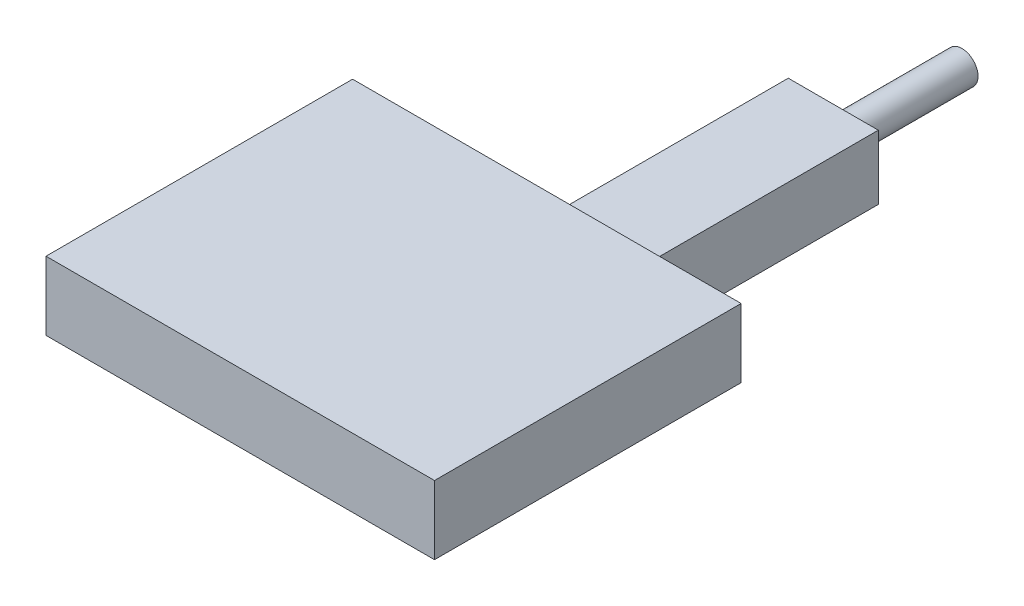
ISO-10303-21;
HEADER;
FILE_DESCRIPTION(('STEP AP214'),'2;1');
FILE_NAME('part.step','',(''),(''),'','','');
FILE_SCHEMA(('AUTOMOTIVE_DESIGN { 1 0 10303 214 1 1 1 1 }'));
ENDSEC;
DATA;
#1=APPLICATION_CONTEXT('core data for automotive mechanical design processes');
#2=APPLICATION_PROTOCOL_DEFINITION('international standard','automotive_design',2000,#1);
#3=PRODUCT_CONTEXT('',#1,'mechanical');
#4=PRODUCT('Part','Part','',(#3));
#5=PRODUCT_RELATED_PRODUCT_CATEGORY('part','',(#4));
#6=PRODUCT_DEFINITION_FORMATION('','',#4);
#7=PRODUCT_DEFINITION_CONTEXT('part definition',#1,'design');
#8=PRODUCT_DEFINITION('design','',#6,#7);
#9=PRODUCT_DEFINITION_SHAPE('','',#8);
#10=(LENGTH_UNIT() NAMED_UNIT(*) SI_UNIT(.MILLI.,.METRE.));
#11=(NAMED_UNIT(*) PLANE_ANGLE_UNIT() SI_UNIT($,.RADIAN.));
#12=(NAMED_UNIT(*) SI_UNIT($,.STERADIAN.) SOLID_ANGLE_UNIT());
#13=UNCERTAINTY_MEASURE_WITH_UNIT(LENGTH_MEASURE(1.E-05),#10,'distance_accuracy_value','');
#14=(GEOMETRIC_REPRESENTATION_CONTEXT(3) GLOBAL_UNCERTAINTY_ASSIGNED_CONTEXT((#13)) GLOBAL_UNIT_ASSIGNED_CONTEXT((#10,
#11,#12)) REPRESENTATION_CONTEXT('',''));
#15=CARTESIAN_POINT('',(0.,0.,0.));
#16=DIRECTION('',(0.,0.,1.));
#17=DIRECTION('',(1.,0.,0.));
#18=AXIS2_PLACEMENT_3D('',#15,#16,#17);
#19=CARTESIAN_POINT('',(-45.3,16.,-35.75));
#20=DIRECTION('',(0.,0.,1.));
#21=DIRECTION('',(1.,0.,0.));
#22=AXIS2_PLACEMENT_3D('',#19,#20,#21);
#23=PLANE('',#22);
#24=DIRECTION('',(0.,-1.,0.));
#25=VECTOR('',#24,1.);
#26=CARTESIAN_POINT('',(25.3,15.,-35.75));
#27=LINE('',#26,#25);
#28=CARTESIAN_POINT('',(25.3,15.,-35.75));
#29=VERTEX_POINT('',#28);
#30=CARTESIAN_POINT('',(25.3,0.,-35.75));
#31=VERTEX_POINT('',#30);
#32=EDGE_CURVE('E205',#29,#31,#27,.T.);
#33=ORIENTED_EDGE('',*,*,#32,.F.);
#34=DIRECTION('',(1.,0.,0.));
#35=VECTOR('',#34,1.);
#36=CARTESIAN_POINT('',(25.3,15.,-35.75));
#37=LINE('',#36,#35);
#38=CARTESIAN_POINT('',(4.30000000000002,15.,-35.75));
#39=VERTEX_POINT('',#38);
#40=EDGE_CURVE('E134',#39,#29,#37,.T.);
#41=ORIENTED_EDGE('',*,*,#40,.F.);
#42=DIRECTION('',(0.,-1.,0.));
#43=VECTOR('',#42,1.);
#44=CARTESIAN_POINT('',(4.30000000000002,15.,-35.75));
#45=LINE('',#44,#43);
#46=CARTESIAN_POINT('',(4.30000000000002,0.,-35.75));
#47=VERTEX_POINT('',#46);
#48=EDGE_CURVE('E150',#39,#47,#45,.T.);
#49=ORIENTED_EDGE('',*,*,#48,.T.);
#50=DIRECTION('',(-1.,0.,0.));
#51=VECTOR('',#50,1.);
#52=CARTESIAN_POINT('',(-45.3,0.,-35.75));
#53=LINE('',#52,#51);
#54=CARTESIAN_POINT('',(-45.3,0.,-35.75));
#55=VERTEX_POINT('',#54);
#56=EDGE_CURVE('E148',#47,#55,#53,.T.);
#57=ORIENTED_EDGE('',*,*,#56,.T.);
#58=DIRECTION('',(0.,-1.,0.));
#59=VECTOR('',#58,1.);
#60=CARTESIAN_POINT('',(-45.3,16.,-35.75));
#61=LINE('',#60,#59);
#62=CARTESIAN_POINT('',(-45.3,16.,-35.75));
#63=VERTEX_POINT('',#62);
#64=EDGE_CURVE('E178',#63,#55,#61,.T.);
#65=ORIENTED_EDGE('',*,*,#64,.F.);
#66=DIRECTION('',(-1.,0.,0.));
#67=VECTOR('',#66,1.);
#68=CARTESIAN_POINT('',(-45.3,16.,-35.75));
#69=LINE('',#68,#67);
#70=CARTESIAN_POINT('',(45.3,16.,-35.75));
#71=VERTEX_POINT('',#70);
#72=EDGE_CURVE('E94',#71,#63,#69,.T.);
#73=ORIENTED_EDGE('',*,*,#72,.F.);
#74=DIRECTION('',(0.,-1.,0.));
#75=VECTOR('',#74,1.);
#76=CARTESIAN_POINT('',(45.3,16.,-35.75));
#77=LINE('',#76,#75);
#78=CARTESIAN_POINT('',(45.3,0.,-35.75));
#79=VERTEX_POINT('',#78);
#80=EDGE_CURVE('E43',#71,#79,#77,.T.);
#81=ORIENTED_EDGE('',*,*,#80,.T.);
#82=EDGE_CURVE('E165',#79,#31,#53,.T.);
#83=ORIENTED_EDGE('',*,*,#82,.T.);
#84=EDGE_LOOP('',(#33,#41,#49,#57,#65,#73,#81,#83));
#85=FACE_BOUND('',#84,.T.);
#86=ADVANCED_FACE('F39',(#85),#23,.F.);
#87=CARTESIAN_POINT('',(45.3,16.,-35.75));
#88=DIRECTION('',(-1.,0.,0.));
#89=DIRECTION('',(0.,0.,1.));
#90=AXIS2_PLACEMENT_3D('',#87,#88,#89);
#91=PLANE('',#90);
#92=DIRECTION('',(0.,0.,-1.));
#93=VECTOR('',#92,1.);
#94=CARTESIAN_POINT('',(45.3,0.,-35.75));
#95=LINE('',#94,#93);
#96=CARTESIAN_POINT('',(45.3,0.,35.75));
#97=VERTEX_POINT('',#96);
#98=EDGE_CURVE('E143',#97,#79,#95,.T.);
#99=ORIENTED_EDGE('',*,*,#98,.T.);
#100=ORIENTED_EDGE('',*,*,#80,.F.);
#101=DIRECTION('',(0.,0.,-1.));
#102=VECTOR('',#101,1.);
#103=CARTESIAN_POINT('',(45.3,16.,-35.75));
#104=LINE('',#103,#102);
#105=CARTESIAN_POINT('',(45.3,16.,35.75));
#106=VERTEX_POINT('',#105);
#107=EDGE_CURVE('E154',#106,#71,#104,.T.);
#108=ORIENTED_EDGE('',*,*,#107,.F.);
#109=DIRECTION('',(0.,-1.,0.));
#110=VECTOR('',#109,1.);
#111=CARTESIAN_POINT('',(45.3,16.,35.75));
#112=LINE('',#111,#110);
#113=EDGE_CURVE('E163',#106,#97,#112,.T.);
#114=ORIENTED_EDGE('',*,*,#113,.T.);
#115=EDGE_LOOP('',(#99,#100,#108,#114));
#116=FACE_BOUND('',#115,.T.);
#117=ADVANCED_FACE('F41',(#116),#91,.F.);
#118=CARTESIAN_POINT('',(-45.3,16.,-35.75));
#119=DIRECTION('',(1.,0.,0.));
#120=DIRECTION('',(0.,0.,-1.));
#121=AXIS2_PLACEMENT_3D('',#118,#119,#120);
#122=PLANE('',#121);
#123=DIRECTION('',(0.,0.,1.));
#124=VECTOR('',#123,1.);
#125=CARTESIAN_POINT('',(-45.3,0.,-35.75));
#126=LINE('',#125,#124);
#127=CARTESIAN_POINT('',(-45.3,0.,35.75));
#128=VERTEX_POINT('',#127);
#129=EDGE_CURVE('E169',#55,#128,#126,.T.);
#130=ORIENTED_EDGE('',*,*,#129,.T.);
#131=DIRECTION('',(0.,-1.,0.));
#132=VECTOR('',#131,1.);
#133=CARTESIAN_POINT('',(-45.3,16.,35.75));
#134=LINE('',#133,#132);
#135=CARTESIAN_POINT('',(-45.3,16.,35.75));
#136=VERTEX_POINT('',#135);
#137=EDGE_CURVE('E176',#136,#128,#134,.T.);
#138=ORIENTED_EDGE('',*,*,#137,.F.);
#139=DIRECTION('',(0.,0.,1.));
#140=VECTOR('',#139,1.);
#141=CARTESIAN_POINT('',(-45.3,16.,-35.75));
#142=LINE('',#141,#140);
#143=EDGE_CURVE('E159',#63,#136,#142,.T.);
#144=ORIENTED_EDGE('',*,*,#143,.F.);
#145=ORIENTED_EDGE('',*,*,#64,.T.);
#146=EDGE_LOOP('',(#130,#138,#144,#145));
#147=FACE_BOUND('',#146,.T.);
#148=ADVANCED_FACE('F211',(#147),#122,.F.);
#149=CARTESIAN_POINT('',(-45.3,16.,35.75));
#150=DIRECTION('',(0.,0.,-1.));
#151=DIRECTION('',(-1.,0.,0.));
#152=AXIS2_PLACEMENT_3D('',#149,#150,#151);
#153=PLANE('',#152);
#154=DIRECTION('',(1.,0.,0.));
#155=VECTOR('',#154,1.);
#156=CARTESIAN_POINT('',(-45.3,0.,35.75));
#157=LINE('',#156,#155);
#158=EDGE_CURVE('E86',#128,#97,#157,.T.);
#159=ORIENTED_EDGE('',*,*,#158,.T.);
#160=ORIENTED_EDGE('',*,*,#113,.F.);
#161=DIRECTION('',(1.,0.,0.));
#162=VECTOR('',#161,1.);
#163=CARTESIAN_POINT('',(-45.3,16.,35.75));
#164=LINE('',#163,#162);
#165=EDGE_CURVE('E65',#136,#106,#164,.T.);
#166=ORIENTED_EDGE('',*,*,#165,.F.);
#167=ORIENTED_EDGE('',*,*,#137,.T.);
#168=EDGE_LOOP('',(#159,#160,#166,#167));
#169=FACE_BOUND('',#168,.T.);
#170=ADVANCED_FACE('F212',(#169),#153,.F.);
#171=CARTESIAN_POINT('',(0.,16.,0.));
#172=DIRECTION('',(0.,1.,0.));
#173=DIRECTION('',(0.,0.,1.));
#174=AXIS2_PLACEMENT_3D('',#171,#172,#173);
#175=PLANE('',#174);
#176=ORIENTED_EDGE('',*,*,#107,.T.);
#177=ORIENTED_EDGE('',*,*,#72,.T.);
#178=ORIENTED_EDGE('',*,*,#143,.T.);
#179=ORIENTED_EDGE('',*,*,#165,.T.);
#180=EDGE_LOOP('',(#176,#177,#178,#179));
#181=FACE_BOUND('',#180,.T.);
#182=ADVANCED_FACE('F213',(#181),#175,.T.);
#183=CARTESIAN_POINT('',(0.,0.,0.));
#184=DIRECTION('',(0.,1.,0.));
#185=DIRECTION('',(0.,0.,1.));
#186=AXIS2_PLACEMENT_3D('',#183,#184,#185);
#187=PLANE('',#186);
#188=ORIENTED_EDGE('',*,*,#98,.F.);
#189=ORIENTED_EDGE('',*,*,#158,.F.);
#190=ORIENTED_EDGE('',*,*,#129,.F.);
#191=ORIENTED_EDGE('',*,*,#56,.F.);
#192=DIRECTION('',(0.,0.,1.));
#193=VECTOR('',#192,1.);
#194=CARTESIAN_POINT('',(4.30000000000002,0.,-35.75));
#195=LINE('',#194,#193);
#196=CARTESIAN_POINT('',(4.30000000000002,0.,-87.75));
#197=VERTEX_POINT('',#196);
#198=EDGE_CURVE('E56',#197,#47,#195,.T.);
#199=ORIENTED_EDGE('',*,*,#198,.F.);
#200=DIRECTION('',(-1.,0.,0.));
#201=VECTOR('',#200,1.);
#202=CARTESIAN_POINT('',(25.3,0.,-87.75));
#203=LINE('',#202,#201);
#204=CARTESIAN_POINT('',(25.3,0.,-87.75));
#205=VERTEX_POINT('',#204);
#206=EDGE_CURVE('E191',#205,#197,#203,.T.);
#207=ORIENTED_EDGE('',*,*,#206,.F.);
#208=DIRECTION('',(0.,0.,-1.));
#209=VECTOR('',#208,1.);
#210=CARTESIAN_POINT('',(25.3,0.,-35.75));
#211=LINE('',#210,#209);
#212=EDGE_CURVE('E141',#31,#205,#211,.T.);
#213=ORIENTED_EDGE('',*,*,#212,.F.);
#214=ORIENTED_EDGE('',*,*,#82,.F.);
#215=EDGE_LOOP('',(#188,#189,#190,#191,#199,#207,#213,#214));
#216=FACE_BOUND('',#215,.T.);
#217=ADVANCED_FACE('F190',(#216),#187,.F.);
#218=CARTESIAN_POINT('',(25.3,15.,-35.75));
#219=DIRECTION('',(-1.,0.,0.));
#220=DIRECTION('',(0.,0.,1.));
#221=AXIS2_PLACEMENT_3D('',#218,#219,#220);
#222=PLANE('',#221);
#223=ORIENTED_EDGE('',*,*,#212,.T.);
#224=DIRECTION('',(0.,-1.,0.));
#225=VECTOR('',#224,1.);
#226=CARTESIAN_POINT('',(25.3,15.,-87.75));
#227=LINE('',#226,#225);
#228=CARTESIAN_POINT('',(25.3,15.,-87.75));
#229=VERTEX_POINT('',#228);
#230=EDGE_CURVE('E122',#229,#205,#227,.T.);
#231=ORIENTED_EDGE('',*,*,#230,.F.);
#232=DIRECTION('',(0.,0.,-1.));
#233=VECTOR('',#232,1.);
#234=CARTESIAN_POINT('',(25.3,15.,-35.75));
#235=LINE('',#234,#233);
#236=EDGE_CURVE('E129',#29,#229,#235,.T.);
#237=ORIENTED_EDGE('',*,*,#236,.F.);
#238=ORIENTED_EDGE('',*,*,#32,.T.);
#239=EDGE_LOOP('',(#223,#231,#237,#238));
#240=FACE_BOUND('',#239,.T.);
#241=ADVANCED_FACE('F139',(#240),#222,.F.);
#242=CARTESIAN_POINT('',(25.3,15.,-87.75));
#243=DIRECTION('',(0.,0.,1.));
#244=DIRECTION('',(1.,0.,0.));
#245=AXIS2_PLACEMENT_3D('',#242,#243,#244);
#246=PLANE('',#245);
#247=CARTESIAN_POINT('',(14.8,7.5,-87.75));
#248=DIRECTION('',(0.,0.,-1.));
#249=DIRECTION('',(-1.,0.,0.));
#250=AXIS2_PLACEMENT_3D('',#247,#248,#249);
#251=CIRCLE('',#250,3.75);
#252=CARTESIAN_POINT('',(11.05,7.5,-87.75));
#253=VERTEX_POINT('',#252);
#254=EDGE_CURVE('E11',#253,#253,#251,.T.);
#255=ORIENTED_EDGE('',*,*,#254,.F.);
#256=EDGE_LOOP('',(#255));
#257=FACE_BOUND('',#256,.T.);
#258=ORIENTED_EDGE('',*,*,#206,.T.);
#259=DIRECTION('',(0.,-1.,0.));
#260=VECTOR('',#259,1.);
#261=CARTESIAN_POINT('',(4.30000000000002,15.,-87.75));
#262=LINE('',#261,#260);
#263=CARTESIAN_POINT('',(4.30000000000002,15.,-87.75));
#264=VERTEX_POINT('',#263);
#265=EDGE_CURVE('E124',#264,#197,#262,.T.);
#266=ORIENTED_EDGE('',*,*,#265,.F.);
#267=DIRECTION('',(-1.,0.,0.));
#268=VECTOR('',#267,1.);
#269=CARTESIAN_POINT('',(25.3,15.,-87.75));
#270=LINE('',#269,#268);
#271=EDGE_CURVE('E118',#229,#264,#270,.T.);
#272=ORIENTED_EDGE('',*,*,#271,.F.);
#273=ORIENTED_EDGE('',*,*,#230,.T.);
#274=EDGE_LOOP('',(#258,#266,#272,#273));
#275=FACE_BOUND('',#274,.T.);
#276=ADVANCED_FACE('F120',(#257,#275),#246,.F.);
#277=CARTESIAN_POINT('',(4.30000000000002,15.,-35.75));
#278=DIRECTION('',(1.,0.,0.));
#279=DIRECTION('',(0.,0.,-1.));
#280=AXIS2_PLACEMENT_3D('',#277,#278,#279);
#281=PLANE('',#280);
#282=ORIENTED_EDGE('',*,*,#198,.T.);
#283=ORIENTED_EDGE('',*,*,#48,.F.);
#284=DIRECTION('',(0.,0.,1.));
#285=VECTOR('',#284,1.);
#286=CARTESIAN_POINT('',(4.30000000000002,15.,-35.75));
#287=LINE('',#286,#285);
#288=EDGE_CURVE('E128',#264,#39,#287,.T.);
#289=ORIENTED_EDGE('',*,*,#288,.F.);
#290=ORIENTED_EDGE('',*,*,#265,.T.);
#291=EDGE_LOOP('',(#282,#283,#289,#290));
#292=FACE_BOUND('',#291,.T.);
#293=ADVANCED_FACE('F266',(#292),#281,.F.);
#294=CARTESIAN_POINT('',(0.,15.,0.));
#295=DIRECTION('',(0.,1.,0.));
#296=DIRECTION('',(0.,0.,1.));
#297=AXIS2_PLACEMENT_3D('',#294,#295,#296);
#298=PLANE('',#297);
#299=ORIENTED_EDGE('',*,*,#236,.T.);
#300=ORIENTED_EDGE('',*,*,#271,.T.);
#301=ORIENTED_EDGE('',*,*,#288,.T.);
#302=ORIENTED_EDGE('',*,*,#40,.T.);
#303=EDGE_LOOP('',(#299,#300,#301,#302));
#304=FACE_BOUND('',#303,.T.);
#305=ADVANCED_FACE('F132',(#304),#298,.T.);
#306=CARTESIAN_POINT('',(14.8,7.5,-117.75));
#307=DIRECTION('',(0.,0.,1.));
#308=DIRECTION('',(1.,0.,0.));
#309=AXIS2_PLACEMENT_3D('',#306,#307,#308);
#310=CYLINDRICAL_SURFACE('',#309,3.75);
#311=CARTESIAN_POINT('',(14.8,7.5,-117.75));
#312=DIRECTION('',(0.,0.,-1.));
#313=DIRECTION('',(-1.,0.,0.));
#314=AXIS2_PLACEMENT_3D('',#311,#312,#313);
#315=CIRCLE('',#314,3.75);
#316=CARTESIAN_POINT('',(11.05,7.5,-117.75));
#317=VERTEX_POINT('',#316);
#318=EDGE_CURVE('E193',#317,#317,#315,.T.);
#319=ORIENTED_EDGE('',*,*,#318,.F.);
#320=EDGE_LOOP('',(#319));
#321=FACE_BOUND('',#320,.T.);
#322=ORIENTED_EDGE('',*,*,#254,.T.);
#323=EDGE_LOOP('',(#322));
#324=FACE_BOUND('',#323,.T.);
#325=ADVANCED_FACE('F279',(#321,#324),#310,.T.);
#326=CARTESIAN_POINT('',(14.8,7.5,-117.75));
#327=DIRECTION('',(0.,0.,-1.));
#328=DIRECTION('',(-1.,0.,0.));
#329=AXIS2_PLACEMENT_3D('',#326,#327,#328);
#330=PLANE('',#329);
#331=ORIENTED_EDGE('',*,*,#318,.T.);
#332=EDGE_LOOP('',(#331));
#333=FACE_BOUND('',#332,.T.);
#334=ADVANCED_FACE('F295',(#333),#330,.T.);
#335=CLOSED_SHELL('',(#86,#117,#148,#170,#182,#217,#241,#276,#293,#305,#325,#334));
#336=MANIFOLD_SOLID_BREP('B2',#335);
#337=ADVANCED_BREP_SHAPE_REPRESENTATION('',(#18,#336),#14);
#338=SHAPE_DEFINITION_REPRESENTATION(#9,#337);
ENDSEC;
END-ISO-10303-21;
